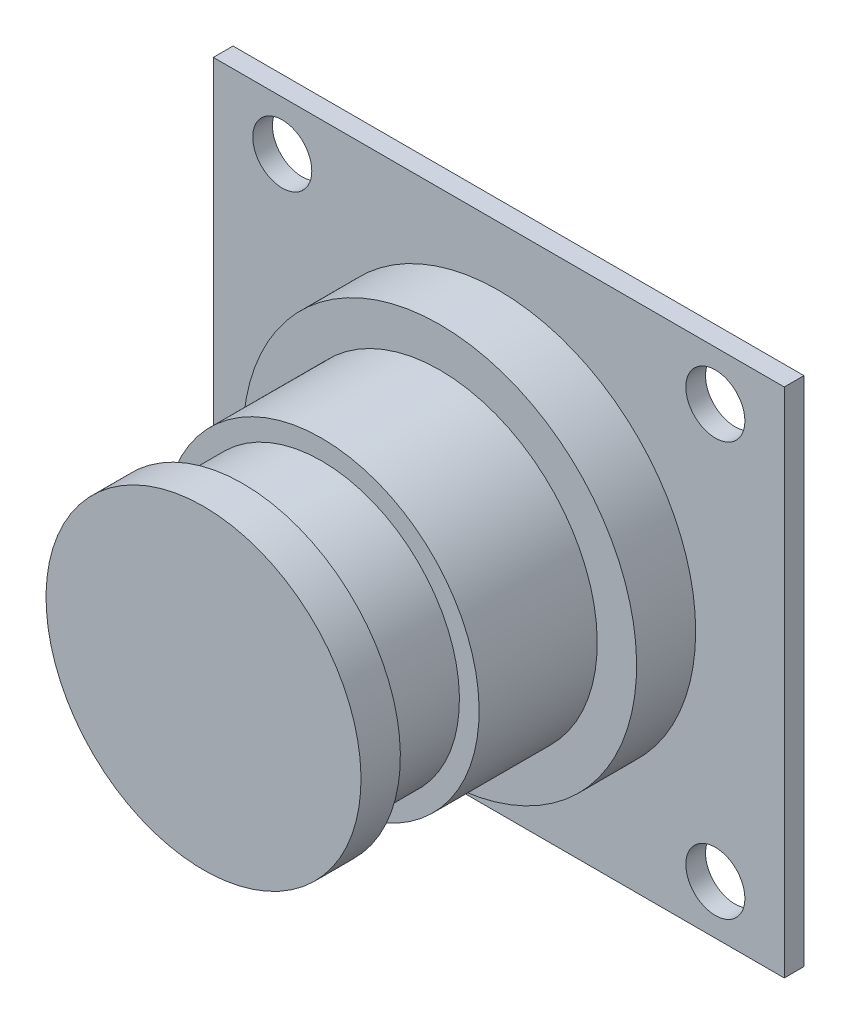
ISO-10303-21;
HEADER;
FILE_DESCRIPTION(('STEP AP214'),'2;1');
FILE_NAME('part.step','',(''),(''),'','','');
FILE_SCHEMA(('AUTOMOTIVE_DESIGN { 1 0 10303 214 1 1 1 1 }'));
ENDSEC;
DATA;
#1=APPLICATION_CONTEXT('core data for automotive mechanical design processes');
#2=APPLICATION_PROTOCOL_DEFINITION('international standard','automotive_design',2000,#1);
#3=PRODUCT_CONTEXT('',#1,'mechanical');
#4=PRODUCT('Part','Part','',(#3));
#5=PRODUCT_RELATED_PRODUCT_CATEGORY('part','',(#4));
#6=PRODUCT_DEFINITION_FORMATION('','',#4);
#7=PRODUCT_DEFINITION_CONTEXT('part definition',#1,'design');
#8=PRODUCT_DEFINITION('design','',#6,#7);
#9=PRODUCT_DEFINITION_SHAPE('','',#8);
#10=(LENGTH_UNIT() NAMED_UNIT(*) SI_UNIT(.MILLI.,.METRE.));
#11=(NAMED_UNIT(*) PLANE_ANGLE_UNIT() SI_UNIT($,.RADIAN.));
#12=(NAMED_UNIT(*) SI_UNIT($,.STERADIAN.) SOLID_ANGLE_UNIT());
#13=UNCERTAINTY_MEASURE_WITH_UNIT(LENGTH_MEASURE(1.E-05),#10,'distance_accuracy_value','');
#14=(GEOMETRIC_REPRESENTATION_CONTEXT(3) GLOBAL_UNCERTAINTY_ASSIGNED_CONTEXT((#13)) GLOBAL_UNIT_ASSIGNED_CONTEXT((#10,
#11,#12)) REPRESENTATION_CONTEXT('',''));
#15=CARTESIAN_POINT('',(0.,0.,0.));
#16=DIRECTION('',(0.,0.,1.));
#17=DIRECTION('',(1.,0.,0.));
#18=AXIS2_PLACEMENT_3D('',#15,#16,#17);
#19=CARTESIAN_POINT('',(0.,0.,1.));
#20=DIRECTION('',(0.,0.,1.));
#21=DIRECTION('',(1.,0.,0.));
#22=AXIS2_PLACEMENT_3D('',#19,#20,#21);
#23=PLANE('',#22);
#24=CARTESIAN_POINT('',(0.,0.,1.));
#25=DIRECTION('',(0.,0.,1.));
#26=DIRECTION('',(1.,0.,0.));
#27=AXIS2_PLACEMENT_3D('',#24,#25,#26);
#28=CIRCLE('',#27,10.);
#29=CARTESIAN_POINT('',(10.,0.,1.));
#30=VERTEX_POINT('',#29);
#31=EDGE_CURVE('E11',#30,#30,#28,.T.);
#32=ORIENTED_EDGE('',*,*,#31,.F.);
#33=EDGE_LOOP('',(#32));
#34=FACE_BOUND('',#33,.T.);
#35=CARTESIAN_POINT('',(11.,-10.5,1.));
#36=DIRECTION('',(0.,0.,1.));
#37=DIRECTION('',(1.,0.,0.));
#38=AXIS2_PLACEMENT_3D('',#35,#36,#37);
#39=CIRCLE('',#38,1.5);
#40=CARTESIAN_POINT('',(12.5,-10.5,1.));
#41=VERTEX_POINT('',#40);
#42=EDGE_CURVE('E144',#41,#41,#39,.T.);
#43=ORIENTED_EDGE('',*,*,#42,.F.);
#44=EDGE_LOOP('',(#43));
#45=FACE_BOUND('',#44,.T.);
#46=CARTESIAN_POINT('',(-11.,10.5,1.));
#47=DIRECTION('',(0.,0.,1.));
#48=DIRECTION('',(1.,0.,0.));
#49=AXIS2_PLACEMENT_3D('',#46,#47,#48);
#50=CIRCLE('',#49,1.5);
#51=CARTESIAN_POINT('',(-9.5,10.5,1.));
#52=VERTEX_POINT('',#51);
#53=EDGE_CURVE('E107',#52,#52,#50,.T.);
#54=ORIENTED_EDGE('',*,*,#53,.F.);
#55=EDGE_LOOP('',(#54));
#56=FACE_BOUND('',#55,.T.);
#57=DIRECTION('',(0.,-1.,0.));
#58=VECTOR('',#57,1.);
#59=CARTESIAN_POINT('',(-14.5,13.,1.));
#60=LINE('',#59,#58);
#61=CARTESIAN_POINT('',(-14.5,13.,1.));
#62=VERTEX_POINT('',#61);
#63=CARTESIAN_POINT('',(-14.5,-13.,1.));
#64=VERTEX_POINT('',#63);
#65=EDGE_CURVE('E90',#62,#64,#60,.T.);
#66=ORIENTED_EDGE('',*,*,#65,.T.);
#67=DIRECTION('',(1.,0.,0.));
#68=VECTOR('',#67,1.);
#69=CARTESIAN_POINT('',(-14.5,-13.,1.));
#70=LINE('',#69,#68);
#71=CARTESIAN_POINT('',(14.5,-13.,1.));
#72=VERTEX_POINT('',#71);
#73=EDGE_CURVE('E85',#64,#72,#70,.T.);
#74=ORIENTED_EDGE('',*,*,#73,.T.);
#75=DIRECTION('',(0.,1.,0.));
#76=VECTOR('',#75,1.);
#77=CARTESIAN_POINT('',(14.5,13.,1.));
#78=LINE('',#77,#76);
#79=CARTESIAN_POINT('',(14.5,13.,1.));
#80=VERTEX_POINT('',#79);
#81=EDGE_CURVE('E88',#72,#80,#78,.T.);
#82=ORIENTED_EDGE('',*,*,#81,.T.);
#83=DIRECTION('',(-1.,0.,0.));
#84=VECTOR('',#83,1.);
#85=CARTESIAN_POINT('',(-14.5,13.,1.));
#86=LINE('',#85,#84);
#87=EDGE_CURVE('E54',#80,#62,#86,.T.);
#88=ORIENTED_EDGE('',*,*,#87,.T.);
#89=EDGE_LOOP('',(#66,#74,#82,#88));
#90=FACE_BOUND('',#89,.T.);
#91=CARTESIAN_POINT('',(11.,10.5,1.));
#92=DIRECTION('',(0.,0.,1.));
#93=DIRECTION('',(1.,0.,0.));
#94=AXIS2_PLACEMENT_3D('',#91,#92,#93);
#95=CIRCLE('',#94,1.5);
#96=CARTESIAN_POINT('',(12.5,10.5,1.));
#97=VERTEX_POINT('',#96);
#98=EDGE_CURVE('E148',#97,#97,#95,.T.);
#99=ORIENTED_EDGE('',*,*,#98,.F.);
#100=EDGE_LOOP('',(#99));
#101=FACE_BOUND('',#100,.T.);
#102=CARTESIAN_POINT('',(-11.,-10.5,1.));
#103=DIRECTION('',(0.,0.,1.));
#104=DIRECTION('',(1.,0.,0.));
#105=AXIS2_PLACEMENT_3D('',#102,#103,#104);
#106=CIRCLE('',#105,1.5);
#107=CARTESIAN_POINT('',(-9.5,-10.5,1.));
#108=VERTEX_POINT('',#107);
#109=EDGE_CURVE('E135',#108,#108,#106,.T.);
#110=ORIENTED_EDGE('',*,*,#109,.F.);
#111=EDGE_LOOP('',(#110));
#112=FACE_BOUND('',#111,.T.);
#113=ADVANCED_FACE('F37',(#34,#45,#56,#90,#101,#112),#23,.T.);
#114=CARTESIAN_POINT('',(0.,0.,0.));
#115=DIRECTION('',(0.,0.,1.));
#116=DIRECTION('',(1.,0.,0.));
#117=AXIS2_PLACEMENT_3D('',#114,#115,#116);
#118=PLANE('',#117);
#119=DIRECTION('',(0.,-1.,0.));
#120=VECTOR('',#119,1.);
#121=CARTESIAN_POINT('',(-14.5,13.,0.));
#122=LINE('',#121,#120);
#123=CARTESIAN_POINT('',(-14.5,13.,0.));
#124=VERTEX_POINT('',#123);
#125=CARTESIAN_POINT('',(-14.5,-13.,0.));
#126=VERTEX_POINT('',#125);
#127=EDGE_CURVE('E104',#124,#126,#122,.T.);
#128=ORIENTED_EDGE('',*,*,#127,.F.);
#129=DIRECTION('',(-1.,0.,0.));
#130=VECTOR('',#129,1.);
#131=CARTESIAN_POINT('',(-14.5,13.,0.));
#132=LINE('',#131,#130);
#133=CARTESIAN_POINT('',(14.5,13.,0.));
#134=VERTEX_POINT('',#133);
#135=EDGE_CURVE('E77',#134,#124,#132,.T.);
#136=ORIENTED_EDGE('',*,*,#135,.F.);
#137=DIRECTION('',(0.,1.,0.));
#138=VECTOR('',#137,1.);
#139=CARTESIAN_POINT('',(14.5,13.,0.));
#140=LINE('',#139,#138);
#141=CARTESIAN_POINT('',(14.5,-13.,0.));
#142=VERTEX_POINT('',#141);
#143=EDGE_CURVE('E71',#142,#134,#140,.T.);
#144=ORIENTED_EDGE('',*,*,#143,.F.);
#145=DIRECTION('',(1.,0.,0.));
#146=VECTOR('',#145,1.);
#147=CARTESIAN_POINT('',(-14.5,-13.,0.));
#148=LINE('',#147,#146);
#149=EDGE_CURVE('E95',#126,#142,#148,.T.);
#150=ORIENTED_EDGE('',*,*,#149,.F.);
#151=EDGE_LOOP('',(#128,#136,#144,#150));
#152=FACE_BOUND('',#151,.T.);
#153=CARTESIAN_POINT('',(-11.,10.5,0.));
#154=DIRECTION('',(0.,0.,1.));
#155=DIRECTION('',(1.,0.,0.));
#156=AXIS2_PLACEMENT_3D('',#153,#154,#155);
#157=CIRCLE('',#156,1.5);
#158=CARTESIAN_POINT('',(-9.5,10.5,0.));
#159=VERTEX_POINT('',#158);
#160=EDGE_CURVE('E122',#159,#159,#157,.T.);
#161=ORIENTED_EDGE('',*,*,#160,.T.);
#162=EDGE_LOOP('',(#161));
#163=FACE_BOUND('',#162,.T.);
#164=CARTESIAN_POINT('',(11.,10.5,0.));
#165=DIRECTION('',(0.,0.,1.));
#166=DIRECTION('',(1.,0.,0.));
#167=AXIS2_PLACEMENT_3D('',#164,#165,#166);
#168=CIRCLE('',#167,1.5);
#169=CARTESIAN_POINT('',(12.5,10.5,0.));
#170=VERTEX_POINT('',#169);
#171=EDGE_CURVE('E126',#170,#170,#168,.T.);
#172=ORIENTED_EDGE('',*,*,#171,.T.);
#173=EDGE_LOOP('',(#172));
#174=FACE_BOUND('',#173,.T.);
#175=CARTESIAN_POINT('',(11.,-10.5,0.));
#176=DIRECTION('',(0.,0.,1.));
#177=DIRECTION('',(1.,0.,0.));
#178=AXIS2_PLACEMENT_3D('',#175,#176,#177);
#179=CIRCLE('',#178,1.5);
#180=CARTESIAN_POINT('',(12.5,-10.5,0.));
#181=VERTEX_POINT('',#180);
#182=EDGE_CURVE('E130',#181,#181,#179,.T.);
#183=ORIENTED_EDGE('',*,*,#182,.T.);
#184=EDGE_LOOP('',(#183));
#185=FACE_BOUND('',#184,.T.);
#186=CARTESIAN_POINT('',(-11.,-10.5,0.));
#187=DIRECTION('',(0.,0.,1.));
#188=DIRECTION('',(1.,0.,0.));
#189=AXIS2_PLACEMENT_3D('',#186,#187,#188);
#190=CIRCLE('',#189,1.5);
#191=CARTESIAN_POINT('',(-9.5,-10.5,0.));
#192=VERTEX_POINT('',#191);
#193=EDGE_CURVE('E133',#192,#192,#190,.T.);
#194=ORIENTED_EDGE('',*,*,#193,.T.);
#195=EDGE_LOOP('',(#194));
#196=FACE_BOUND('',#195,.T.);
#197=ADVANCED_FACE('F115',(#152,#163,#174,#185,#196),#118,.F.);
#198=CARTESIAN_POINT('',(-14.5,13.,1.));
#199=DIRECTION('',(1.,0.,0.));
#200=DIRECTION('',(0.,1.,0.));
#201=AXIS2_PLACEMENT_3D('',#198,#199,#200);
#202=PLANE('',#201);
#203=ORIENTED_EDGE('',*,*,#127,.T.);
#204=DIRECTION('',(0.,0.,-1.));
#205=VECTOR('',#204,1.);
#206=CARTESIAN_POINT('',(-14.5,-13.,1.));
#207=LINE('',#206,#205);
#208=EDGE_CURVE('E46',#64,#126,#207,.T.);
#209=ORIENTED_EDGE('',*,*,#208,.F.);
#210=ORIENTED_EDGE('',*,*,#65,.F.);
#211=DIRECTION('',(0.,0.,-1.));
#212=VECTOR('',#211,1.);
#213=CARTESIAN_POINT('',(-14.5,13.,1.));
#214=LINE('',#213,#212);
#215=EDGE_CURVE('E100',#62,#124,#214,.T.);
#216=ORIENTED_EDGE('',*,*,#215,.T.);
#217=EDGE_LOOP('',(#203,#209,#210,#216));
#218=FACE_BOUND('',#217,.T.);
#219=ADVANCED_FACE('F39',(#218),#202,.F.);
#220=CARTESIAN_POINT('',(-14.5,-13.,1.));
#221=DIRECTION('',(0.,1.,0.));
#222=DIRECTION('',(-1.,0.,0.));
#223=AXIS2_PLACEMENT_3D('',#220,#221,#222);
#224=PLANE('',#223);
#225=ORIENTED_EDGE('',*,*,#149,.T.);
#226=DIRECTION('',(0.,0.,-1.));
#227=VECTOR('',#226,1.);
#228=CARTESIAN_POINT('',(14.5,-13.,1.));
#229=LINE('',#228,#227);
#230=EDGE_CURVE('E93',#72,#142,#229,.T.);
#231=ORIENTED_EDGE('',*,*,#230,.F.);
#232=ORIENTED_EDGE('',*,*,#73,.F.);
#233=ORIENTED_EDGE('',*,*,#208,.T.);
#234=EDGE_LOOP('',(#225,#231,#232,#233));
#235=FACE_BOUND('',#234,.T.);
#236=ADVANCED_FACE('F94',(#235),#224,.F.);
#237=CARTESIAN_POINT('',(14.5,13.,1.));
#238=DIRECTION('',(-1.,0.,0.));
#239=DIRECTION('',(0.,-1.,0.));
#240=AXIS2_PLACEMENT_3D('',#237,#238,#239);
#241=PLANE('',#240);
#242=ORIENTED_EDGE('',*,*,#143,.T.);
#243=DIRECTION('',(0.,0.,-1.));
#244=VECTOR('',#243,1.);
#245=CARTESIAN_POINT('',(14.5,13.,1.));
#246=LINE('',#245,#244);
#247=EDGE_CURVE('E96',#80,#134,#246,.T.);
#248=ORIENTED_EDGE('',*,*,#247,.F.);
#249=ORIENTED_EDGE('',*,*,#81,.F.);
#250=ORIENTED_EDGE('',*,*,#230,.T.);
#251=EDGE_LOOP('',(#242,#248,#249,#250));
#252=FACE_BOUND('',#251,.T.);
#253=ADVANCED_FACE('F98',(#252),#241,.F.);
#254=CARTESIAN_POINT('',(-14.5,13.,1.));
#255=DIRECTION('',(0.,-1.,0.));
#256=DIRECTION('',(1.,0.,0.));
#257=AXIS2_PLACEMENT_3D('',#254,#255,#256);
#258=PLANE('',#257);
#259=ORIENTED_EDGE('',*,*,#135,.T.);
#260=ORIENTED_EDGE('',*,*,#215,.F.);
#261=ORIENTED_EDGE('',*,*,#87,.F.);
#262=ORIENTED_EDGE('',*,*,#247,.T.);
#263=EDGE_LOOP('',(#259,#260,#261,#262));
#264=FACE_BOUND('',#263,.T.);
#265=ADVANCED_FACE('F169',(#264),#258,.F.);
#266=CARTESIAN_POINT('',(-11.,10.5,1.));
#267=DIRECTION('',(0.,0.,-1.));
#268=DIRECTION('',(-1.,0.,0.));
#269=AXIS2_PLACEMENT_3D('',#266,#267,#268);
#270=CYLINDRICAL_SURFACE('',#269,1.5);
#271=ORIENTED_EDGE('',*,*,#53,.T.);
#272=EDGE_LOOP('',(#271));
#273=FACE_BOUND('',#272,.T.);
#274=ORIENTED_EDGE('',*,*,#160,.F.);
#275=EDGE_LOOP('',(#274));
#276=FACE_BOUND('',#275,.T.);
#277=ADVANCED_FACE('F156',(#273,#276),#270,.F.);
#278=CARTESIAN_POINT('',(11.,10.5,1.));
#279=DIRECTION('',(0.,0.,-1.));
#280=DIRECTION('',(-1.,0.,0.));
#281=AXIS2_PLACEMENT_3D('',#278,#279,#280);
#282=CYLINDRICAL_SURFACE('',#281,1.5);
#283=ORIENTED_EDGE('',*,*,#98,.T.);
#284=EDGE_LOOP('',(#283));
#285=FACE_BOUND('',#284,.T.);
#286=ORIENTED_EDGE('',*,*,#171,.F.);
#287=EDGE_LOOP('',(#286));
#288=FACE_BOUND('',#287,.T.);
#289=ADVANCED_FACE('F212',(#285,#288),#282,.F.);
#290=CARTESIAN_POINT('',(11.,-10.5,1.));
#291=DIRECTION('',(0.,0.,-1.));
#292=DIRECTION('',(-1.,0.,0.));
#293=AXIS2_PLACEMENT_3D('',#290,#291,#292);
#294=CYLINDRICAL_SURFACE('',#293,1.5);
#295=ORIENTED_EDGE('',*,*,#42,.T.);
#296=EDGE_LOOP('',(#295));
#297=FACE_BOUND('',#296,.T.);
#298=ORIENTED_EDGE('',*,*,#182,.F.);
#299=EDGE_LOOP('',(#298));
#300=FACE_BOUND('',#299,.T.);
#301=ADVANCED_FACE('F219',(#297,#300),#294,.F.);
#302=CARTESIAN_POINT('',(-11.,-10.5,1.));
#303=DIRECTION('',(0.,0.,-1.));
#304=DIRECTION('',(-1.,0.,0.));
#305=AXIS2_PLACEMENT_3D('',#302,#303,#304);
#306=CYLINDRICAL_SURFACE('',#305,1.5);
#307=ORIENTED_EDGE('',*,*,#109,.T.);
#308=EDGE_LOOP('',(#307));
#309=FACE_BOUND('',#308,.T.);
#310=ORIENTED_EDGE('',*,*,#193,.F.);
#311=EDGE_LOOP('',(#310));
#312=FACE_BOUND('',#311,.T.);
#313=ADVANCED_FACE('F227',(#309,#312),#306,.F.);
#314=CARTESIAN_POINT('',(0.,0.,16.));
#315=DIRECTION('',(0.,0.,1.));
#316=DIRECTION('',(0.,-1.,0.));
#317=AXIS2_PLACEMENT_3D('',#314,#315,#316);
#318=PLANE('',#317);
#319=CARTESIAN_POINT('',(0.,0.,16.));
#320=DIRECTION('',(0.,0.,-1.));
#321=DIRECTION('',(0.,1.,0.));
#322=AXIS2_PLACEMENT_3D('',#319,#320,#321);
#323=CIRCLE('',#322,8.);
#324=CARTESIAN_POINT('',(0.,8.,16.));
#325=VERTEX_POINT('',#324);
#326=EDGE_CURVE('E136',#325,#325,#323,.T.);
#327=ORIENTED_EDGE('',*,*,#326,.F.);
#328=EDGE_LOOP('',(#327));
#329=FACE_BOUND('',#328,.T.);
#330=ADVANCED_FACE('F236',(#329),#318,.T.);
#331=CARTESIAN_POINT('',(0.,0.,1.));
#332=DIRECTION('',(0.,0.,-1.));
#333=DIRECTION('',(0.,1.,0.));
#334=AXIS2_PLACEMENT_3D('',#331,#332,#333);
#335=CYLINDRICAL_SURFACE('',#334,8.);
#336=ORIENTED_EDGE('',*,*,#326,.T.);
#337=EDGE_LOOP('',(#336));
#338=FACE_BOUND('',#337,.T.);
#339=CARTESIAN_POINT('',(0.,0.,14.));
#340=DIRECTION('',(0.,0.,-1.));
#341=DIRECTION('',(0.,1.,0.));
#342=AXIS2_PLACEMENT_3D('',#339,#340,#341);
#343=CIRCLE('',#342,8.);
#344=CARTESIAN_POINT('',(0.,8.,14.));
#345=VERTEX_POINT('',#344);
#346=EDGE_CURVE('E141',#345,#345,#343,.T.);
#347=ORIENTED_EDGE('',*,*,#346,.F.);
#348=EDGE_LOOP('',(#347));
#349=FACE_BOUND('',#348,.T.);
#350=ADVANCED_FACE('F245',(#338,#349),#335,.T.);
#351=CARTESIAN_POINT('',(0.,8.,14.));
#352=DIRECTION('',(0.,0.,-1.));
#353=DIRECTION('',(0.,1.,0.));
#354=AXIS2_PLACEMENT_3D('',#351,#352,#353);
#355=PLANE('',#354);
#356=ORIENTED_EDGE('',*,*,#346,.T.);
#357=EDGE_LOOP('',(#356));
#358=FACE_BOUND('',#357,.T.);
#359=CARTESIAN_POINT('',(0.,0.,14.));
#360=DIRECTION('',(0.,0.,-1.));
#361=DIRECTION('',(0.,1.,0.));
#362=AXIS2_PLACEMENT_3D('',#359,#360,#361);
#363=CIRCLE('',#362,7.);
#364=CARTESIAN_POINT('',(0.,7.,14.));
#365=VERTEX_POINT('',#364);
#366=EDGE_CURVE('E340',#365,#365,#363,.T.);
#367=ORIENTED_EDGE('',*,*,#366,.F.);
#368=EDGE_LOOP('',(#367));
#369=FACE_BOUND('',#368,.T.);
#370=ADVANCED_FACE('F254',(#358,#369),#355,.T.);
#371=CARTESIAN_POINT('',(0.,0.,1.));
#372=DIRECTION('',(0.,0.,-1.));
#373=DIRECTION('',(0.,1.,0.));
#374=AXIS2_PLACEMENT_3D('',#371,#372,#373);
#375=CYLINDRICAL_SURFACE('',#374,7.);
#376=ORIENTED_EDGE('',*,*,#366,.T.);
#377=EDGE_LOOP('',(#376));
#378=FACE_BOUND('',#377,.T.);
#379=CARTESIAN_POINT('',(0.,0.,10.));
#380=DIRECTION('',(0.,0.,-1.));
#381=DIRECTION('',(0.,1.,0.));
#382=AXIS2_PLACEMENT_3D('',#379,#380,#381);
#383=CIRCLE('',#382,7.);
#384=CARTESIAN_POINT('',(0.,7.,10.));
#385=VERTEX_POINT('',#384);
#386=EDGE_CURVE('E337',#385,#385,#383,.T.);
#387=ORIENTED_EDGE('',*,*,#386,.F.);
#388=EDGE_LOOP('',(#387));
#389=FACE_BOUND('',#388,.T.);
#390=ADVANCED_FACE('F263',(#378,#389),#375,.T.);
#391=CARTESIAN_POINT('',(0.,7.,10.));
#392=DIRECTION('',(0.,0.,1.));
#393=DIRECTION('',(0.,-1.,0.));
#394=AXIS2_PLACEMENT_3D('',#391,#392,#393);
#395=PLANE('',#394);
#396=ORIENTED_EDGE('',*,*,#386,.T.);
#397=EDGE_LOOP('',(#396));
#398=FACE_BOUND('',#397,.T.);
#399=CARTESIAN_POINT('',(0.,0.,10.));
#400=DIRECTION('',(0.,0.,-1.));
#401=DIRECTION('',(0.,1.,0.));
#402=AXIS2_PLACEMENT_3D('',#399,#400,#401);
#403=CIRCLE('',#402,8.);
#404=CARTESIAN_POINT('',(0.,8.,10.));
#405=VERTEX_POINT('',#404);
#406=EDGE_CURVE('E332',#405,#405,#403,.T.);
#407=ORIENTED_EDGE('',*,*,#406,.F.);
#408=EDGE_LOOP('',(#407));
#409=FACE_BOUND('',#408,.T.);
#410=ADVANCED_FACE('F272',(#398,#409),#395,.T.);
#411=CARTESIAN_POINT('',(0.,0.,1.));
#412=DIRECTION('',(0.,0.,-1.));
#413=DIRECTION('',(0.,1.,0.));
#414=AXIS2_PLACEMENT_3D('',#411,#412,#413);
#415=CYLINDRICAL_SURFACE('',#414,8.);
#416=ORIENTED_EDGE('',*,*,#406,.T.);
#417=EDGE_LOOP('',(#416));
#418=FACE_BOUND('',#417,.T.);
#419=CARTESIAN_POINT('',(0.,0.,4.));
#420=DIRECTION('',(0.,0.,-1.));
#421=DIRECTION('',(0.,1.,0.));
#422=AXIS2_PLACEMENT_3D('',#419,#420,#421);
#423=CIRCLE('',#422,8.);
#424=CARTESIAN_POINT('',(0.,8.,4.));
#425=VERTEX_POINT('',#424);
#426=EDGE_CURVE('E329',#425,#425,#423,.T.);
#427=ORIENTED_EDGE('',*,*,#426,.F.);
#428=EDGE_LOOP('',(#427));
#429=FACE_BOUND('',#428,.T.);
#430=ADVANCED_FACE('F281',(#418,#429),#415,.T.);
#431=CARTESIAN_POINT('',(0.,8.,4.));
#432=DIRECTION('',(0.,0.,1.));
#433=DIRECTION('',(0.,-1.,0.));
#434=AXIS2_PLACEMENT_3D('',#431,#432,#433);
#435=PLANE('',#434);
#436=ORIENTED_EDGE('',*,*,#426,.T.);
#437=EDGE_LOOP('',(#436));
#438=FACE_BOUND('',#437,.T.);
#439=CARTESIAN_POINT('',(0.,0.,4.));
#440=DIRECTION('',(0.,0.,-1.));
#441=DIRECTION('',(0.,1.,0.));
#442=AXIS2_PLACEMENT_3D('',#439,#440,#441);
#443=CIRCLE('',#442,10.);
#444=CARTESIAN_POINT('',(0.,10.,4.));
#445=VERTEX_POINT('',#444);
#446=EDGE_CURVE('E327',#445,#445,#443,.T.);
#447=ORIENTED_EDGE('',*,*,#446,.F.);
#448=EDGE_LOOP('',(#447));
#449=FACE_BOUND('',#448,.T.);
#450=ADVANCED_FACE('F290',(#438,#449),#435,.T.);
#451=CARTESIAN_POINT('',(0.,0.,1.));
#452=DIRECTION('',(0.,0.,-1.));
#453=DIRECTION('',(0.,1.,0.));
#454=AXIS2_PLACEMENT_3D('',#451,#452,#453);
#455=CYLINDRICAL_SURFACE('',#454,10.);
#456=ORIENTED_EDGE('',*,*,#446,.T.);
#457=EDGE_LOOP('',(#456));
#458=FACE_BOUND('',#457,.T.);
#459=ORIENTED_EDGE('',*,*,#31,.T.);
#460=EDGE_LOOP('',(#459));
#461=FACE_BOUND('',#460,.T.);
#462=ADVANCED_FACE('F299',(#458,#461),#455,.T.);
#463=CLOSED_SHELL('',(#113,#197,#219,#236,#253,#265,#277,#289,#301,#313,#330,#350,#370,#390,
#410,#430,#450,#462));
#464=MANIFOLD_SOLID_BREP('B2',#463);
#465=ADVANCED_BREP_SHAPE_REPRESENTATION('',(#18,#464),#14);
#466=SHAPE_DEFINITION_REPRESENTATION(#9,#465);
ENDSEC;
END-ISO-10303-21;
